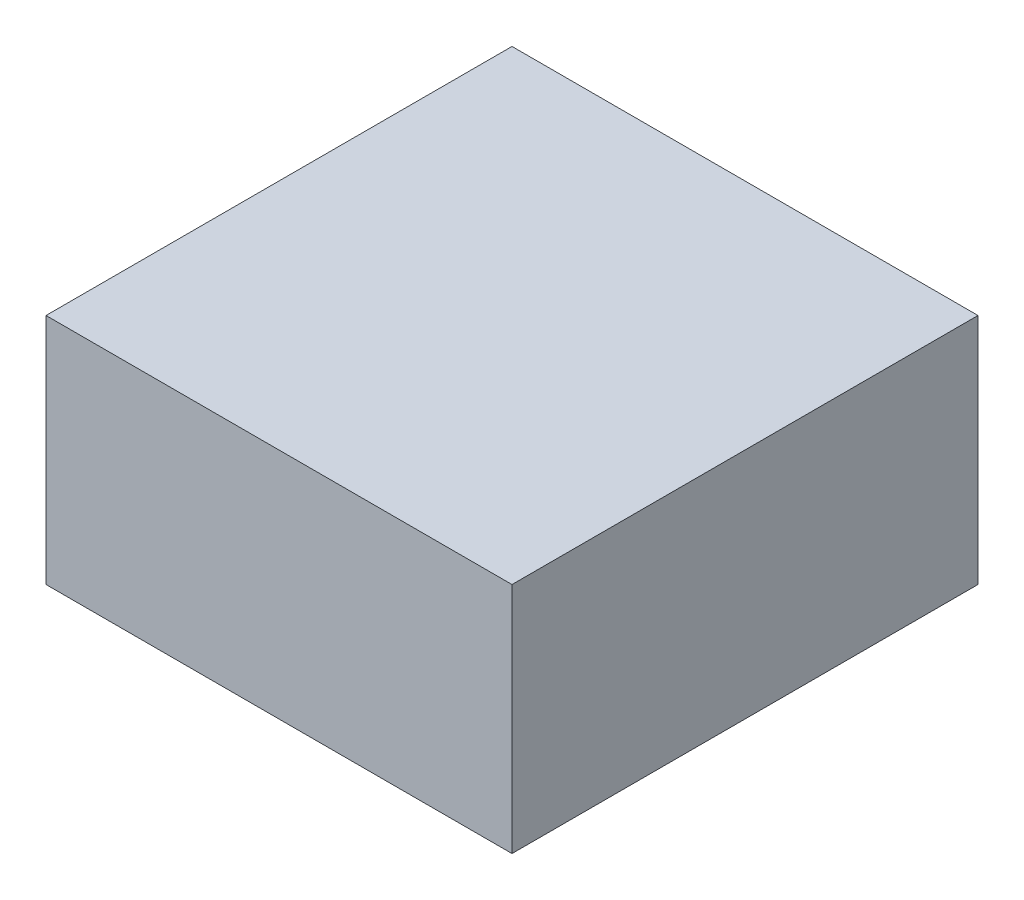
ISO-10303-21;
HEADER;
FILE_DESCRIPTION(('STEP AP214'),'2;1');
FILE_NAME('part.step','',(''),(''),'','','');
FILE_SCHEMA(('AUTOMOTIVE_DESIGN { 1 0 10303 214 1 1 1 1 }'));
ENDSEC;
DATA;
#1=APPLICATION_CONTEXT('core data for automotive mechanical design processes');
#2=APPLICATION_PROTOCOL_DEFINITION('international standard','automotive_design',2000,#1);
#3=PRODUCT_CONTEXT('',#1,'mechanical');
#4=PRODUCT('Part','Part','',(#3));
#5=PRODUCT_RELATED_PRODUCT_CATEGORY('part','',(#4));
#6=PRODUCT_DEFINITION_FORMATION('','',#4);
#7=PRODUCT_DEFINITION_CONTEXT('part definition',#1,'design');
#8=PRODUCT_DEFINITION('design','',#6,#7);
#9=PRODUCT_DEFINITION_SHAPE('','',#8);
#10=(LENGTH_UNIT() NAMED_UNIT(*) SI_UNIT(.MILLI.,.METRE.));
#11=(NAMED_UNIT(*) PLANE_ANGLE_UNIT() SI_UNIT($,.RADIAN.));
#12=(NAMED_UNIT(*) SI_UNIT($,.STERADIAN.) SOLID_ANGLE_UNIT());
#13=UNCERTAINTY_MEASURE_WITH_UNIT(LENGTH_MEASURE(1.E-05),#10,'distance_accuracy_value','');
#14=(GEOMETRIC_REPRESENTATION_CONTEXT(3) GLOBAL_UNCERTAINTY_ASSIGNED_CONTEXT((#13)) GLOBAL_UNIT_ASSIGNED_CONTEXT((#10,
#11,#12)) REPRESENTATION_CONTEXT('',''));
#15=CARTESIAN_POINT('',(0.,0.,0.));
#16=DIRECTION('',(0.,0.,1.));
#17=DIRECTION('',(1.,0.,0.));
#18=AXIS2_PLACEMENT_3D('',#15,#16,#17);
#19=CARTESIAN_POINT('',(10.1234567891235,10.1234567891235,10.1234567891235));
#20=DIRECTION('',(-1.,0.,0.));
#21=DIRECTION('',(0.,0.,1.));
#22=AXIS2_PLACEMENT_3D('',#19,#20,#21);
#23=PLANE('',#22);
#24=DIRECTION('',(0.,0.,-1.));
#25=VECTOR('',#24,1.);
#26=CARTESIAN_POINT('',(10.1234567891235,0.,10.1234567891235));
#27=LINE('',#26,#25);
#28=CARTESIAN_POINT('',(10.1234567891235,0.,10.1234567891235));
#29=VERTEX_POINT('',#28);
#30=CARTESIAN_POINT('',(10.1234567891235,0.,-10.1234567891235));
#31=VERTEX_POINT('',#30);
#32=EDGE_CURVE('E96',#29,#31,#27,.T.);
#33=ORIENTED_EDGE('',*,*,#32,.T.);
#34=DIRECTION('',(0.,-1.,0.));
#35=VECTOR('',#34,1.);
#36=CARTESIAN_POINT('',(10.1234567891235,10.1234567891235,-10.1234567891235));
#37=LINE('',#36,#35);
#38=CARTESIAN_POINT('',(10.1234567891235,10.1234567891235,-10.1234567891235));
#39=VERTEX_POINT('',#38);
#40=EDGE_CURVE('E11',#39,#31,#37,.T.);
#41=ORIENTED_EDGE('',*,*,#40,.F.);
#42=DIRECTION('',(0.,0.,-1.));
#43=VECTOR('',#42,1.);
#44=CARTESIAN_POINT('',(10.1234567891235,10.1234567891235,10.1234567891235));
#45=LINE('',#44,#43);
#46=CARTESIAN_POINT('',(10.1234567891235,10.1234567891235,10.1234567891235));
#47=VERTEX_POINT('',#46);
#48=EDGE_CURVE('E84',#47,#39,#45,.T.);
#49=ORIENTED_EDGE('',*,*,#48,.F.);
#50=DIRECTION('',(0.,-1.,0.));
#51=VECTOR('',#50,1.);
#52=CARTESIAN_POINT('',(10.1234567891235,10.1234567891235,10.1234567891235));
#53=LINE('',#52,#51);
#54=EDGE_CURVE('E92',#47,#29,#53,.T.);
#55=ORIENTED_EDGE('',*,*,#54,.T.);
#56=EDGE_LOOP('',(#33,#41,#49,#55));
#57=FACE_BOUND('',#56,.T.);
#58=ADVANCED_FACE('F33',(#57),#23,.F.);
#59=CARTESIAN_POINT('',(-10.1234567891235,10.1234567891235,-10.1234567891235));
#60=DIRECTION('',(0.,0.,1.));
#61=DIRECTION('',(1.,0.,0.));
#62=AXIS2_PLACEMENT_3D('',#59,#60,#61);
#63=PLANE('',#62);
#64=DIRECTION('',(-1.,0.,0.));
#65=VECTOR('',#64,1.);
#66=CARTESIAN_POINT('',(-10.1234567891235,0.,-10.1234567891235));
#67=LINE('',#66,#65);
#68=CARTESIAN_POINT('',(-10.1234567891235,0.,-10.1234567891235));
#69=VERTEX_POINT('',#68);
#70=EDGE_CURVE('E88',#31,#69,#67,.T.);
#71=ORIENTED_EDGE('',*,*,#70,.T.);
#72=DIRECTION('',(0.,-1.,0.));
#73=VECTOR('',#72,1.);
#74=CARTESIAN_POINT('',(-10.1234567891235,10.1234567891235,-10.1234567891235));
#75=LINE('',#74,#73);
#76=CARTESIAN_POINT('',(-10.1234567891235,10.1234567891235,-10.1234567891235));
#77=VERTEX_POINT('',#76);
#78=EDGE_CURVE('E41',#77,#69,#75,.T.);
#79=ORIENTED_EDGE('',*,*,#78,.F.);
#80=DIRECTION('',(-1.,0.,0.));
#81=VECTOR('',#80,1.);
#82=CARTESIAN_POINT('',(-10.1234567891235,10.1234567891235,-10.1234567891235));
#83=LINE('',#82,#81);
#84=EDGE_CURVE('E79',#39,#77,#83,.T.);
#85=ORIENTED_EDGE('',*,*,#84,.F.);
#86=ORIENTED_EDGE('',*,*,#40,.T.);
#87=EDGE_LOOP('',(#71,#79,#85,#86));
#88=FACE_BOUND('',#87,.T.);
#89=ADVANCED_FACE('F87',(#88),#63,.F.);
#90=CARTESIAN_POINT('',(-10.1234567891235,10.1234567891235,10.1234567891235));
#91=DIRECTION('',(1.,0.,0.));
#92=DIRECTION('',(0.,0.,-1.));
#93=AXIS2_PLACEMENT_3D('',#90,#91,#92);
#94=PLANE('',#93);
#95=DIRECTION('',(0.,0.,1.));
#96=VECTOR('',#95,1.);
#97=CARTESIAN_POINT('',(-10.1234567891235,0.,10.1234567891235));
#98=LINE('',#97,#96);
#99=CARTESIAN_POINT('',(-10.1234567891235,0.,10.1234567891235));
#100=VERTEX_POINT('',#99);
#101=EDGE_CURVE('E66',#69,#100,#98,.T.);
#102=ORIENTED_EDGE('',*,*,#101,.T.);
#103=DIRECTION('',(0.,-1.,0.));
#104=VECTOR('',#103,1.);
#105=CARTESIAN_POINT('',(-10.1234567891235,10.1234567891235,10.1234567891235));
#106=LINE('',#105,#104);
#107=CARTESIAN_POINT('',(-10.1234567891235,10.1234567891235,10.1234567891235));
#108=VERTEX_POINT('',#107);
#109=EDGE_CURVE('E89',#108,#100,#106,.T.);
#110=ORIENTED_EDGE('',*,*,#109,.F.);
#111=DIRECTION('',(0.,0.,1.));
#112=VECTOR('',#111,1.);
#113=CARTESIAN_POINT('',(-10.1234567891235,10.1234567891235,10.1234567891235));
#114=LINE('',#113,#112);
#115=EDGE_CURVE('E82',#77,#108,#114,.T.);
#116=ORIENTED_EDGE('',*,*,#115,.F.);
#117=ORIENTED_EDGE('',*,*,#78,.T.);
#118=EDGE_LOOP('',(#102,#110,#116,#117));
#119=FACE_BOUND('',#118,.T.);
#120=ADVANCED_FACE('F90',(#119),#94,.F.);
#121=CARTESIAN_POINT('',(-10.1234567891235,10.1234567891235,10.1234567891235));
#122=DIRECTION('',(0.,0.,-1.));
#123=DIRECTION('',(-1.,0.,0.));
#124=AXIS2_PLACEMENT_3D('',#121,#122,#123);
#125=PLANE('',#124);
#126=DIRECTION('',(1.,0.,0.));
#127=VECTOR('',#126,1.);
#128=CARTESIAN_POINT('',(-10.1234567891235,0.,10.1234567891235));
#129=LINE('',#128,#127);
#130=EDGE_CURVE('E72',#100,#29,#129,.T.);
#131=ORIENTED_EDGE('',*,*,#130,.T.);
#132=ORIENTED_EDGE('',*,*,#54,.F.);
#133=DIRECTION('',(1.,0.,0.));
#134=VECTOR('',#133,1.);
#135=CARTESIAN_POINT('',(-10.1234567891235,10.1234567891235,10.1234567891235));
#136=LINE('',#135,#134);
#137=EDGE_CURVE('E49',#108,#47,#136,.T.);
#138=ORIENTED_EDGE('',*,*,#137,.F.);
#139=ORIENTED_EDGE('',*,*,#109,.T.);
#140=EDGE_LOOP('',(#131,#132,#138,#139));
#141=FACE_BOUND('',#140,.T.);
#142=ADVANCED_FACE('F103',(#141),#125,.F.);
#143=CARTESIAN_POINT('',(0.,10.1234567891235,0.));
#144=DIRECTION('',(0.,-1.,0.));
#145=DIRECTION('',(0.,0.,-1.));
#146=AXIS2_PLACEMENT_3D('',#143,#144,#145);
#147=PLANE('',#146);
#148=ORIENTED_EDGE('',*,*,#48,.T.);
#149=ORIENTED_EDGE('',*,*,#84,.T.);
#150=ORIENTED_EDGE('',*,*,#115,.T.);
#151=ORIENTED_EDGE('',*,*,#137,.T.);
#152=EDGE_LOOP('',(#148,#149,#150,#151));
#153=FACE_BOUND('',#152,.T.);
#154=ADVANCED_FACE('F80',(#153),#147,.F.);
#155=CARTESIAN_POINT('',(0.,0.,0.));
#156=DIRECTION('',(0.,-1.,0.));
#157=DIRECTION('',(0.,0.,-1.));
#158=AXIS2_PLACEMENT_3D('',#155,#156,#157);
#159=PLANE('',#158);
#160=ORIENTED_EDGE('',*,*,#32,.F.);
#161=ORIENTED_EDGE('',*,*,#130,.F.);
#162=ORIENTED_EDGE('',*,*,#101,.F.);
#163=ORIENTED_EDGE('',*,*,#70,.F.);
#164=EDGE_LOOP('',(#160,#161,#162,#163));
#165=FACE_BOUND('',#164,.T.);
#166=ADVANCED_FACE('F106',(#165),#159,.T.);
#167=CLOSED_SHELL('',(#58,#89,#120,#142,#154,#166));
#168=MANIFOLD_SOLID_BREP('B2',#167);
#169=ADVANCED_BREP_SHAPE_REPRESENTATION('',(#18,#168),#14);
#170=SHAPE_DEFINITION_REPRESENTATION(#9,#169);
ENDSEC;
END-ISO-10303-21;
